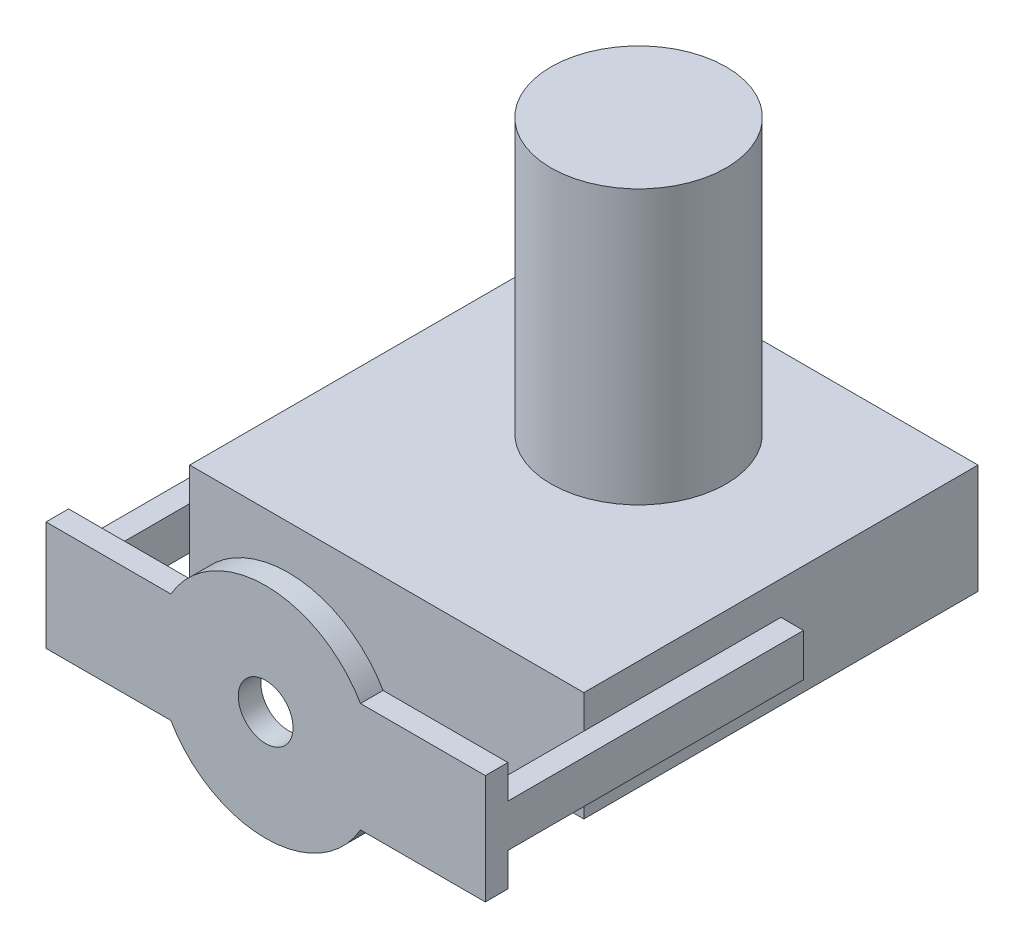
ISO-10303-21;
HEADER;
FILE_DESCRIPTION(('STEP AP214'),'2;1');
FILE_NAME('part.step','',(''),(''),'','','');
FILE_SCHEMA(('AUTOMOTIVE_DESIGN { 1 0 10303 214 1 1 1 1 }'));
ENDSEC;
DATA;
#1=APPLICATION_CONTEXT('core data for automotive mechanical design processes');
#2=APPLICATION_PROTOCOL_DEFINITION('international standard','automotive_design',2000,#1);
#3=PRODUCT_CONTEXT('',#1,'mechanical');
#4=PRODUCT('Part','Part','',(#3));
#5=PRODUCT_RELATED_PRODUCT_CATEGORY('part','',(#4));
#6=PRODUCT_DEFINITION_FORMATION('','',#4);
#7=PRODUCT_DEFINITION_CONTEXT('part definition',#1,'design');
#8=PRODUCT_DEFINITION('design','',#6,#7);
#9=PRODUCT_DEFINITION_SHAPE('','',#8);
#10=(LENGTH_UNIT() NAMED_UNIT(*) SI_UNIT(.MILLI.,.METRE.));
#11=(NAMED_UNIT(*) PLANE_ANGLE_UNIT() SI_UNIT($,.RADIAN.));
#12=(NAMED_UNIT(*) SI_UNIT($,.STERADIAN.) SOLID_ANGLE_UNIT());
#13=UNCERTAINTY_MEASURE_WITH_UNIT(LENGTH_MEASURE(1.E-05),#10,'distance_accuracy_value','');
#14=(GEOMETRIC_REPRESENTATION_CONTEXT(3) GLOBAL_UNCERTAINTY_ASSIGNED_CONTEXT((#13)) GLOBAL_UNIT_ASSIGNED_CONTEXT((#10,
#11,#12)) REPRESENTATION_CONTEXT('',''));
#15=CARTESIAN_POINT('',(0.,0.,0.));
#16=DIRECTION('',(0.,0.,1.));
#17=DIRECTION('',(1.,0.,0.));
#18=AXIS2_PLACEMENT_3D('',#15,#16,#17);
#19=CARTESIAN_POINT('',(18.,10.,-18.));
#20=DIRECTION('',(-1.,0.,0.));
#21=DIRECTION('',(0.,0.,1.));
#22=AXIS2_PLACEMENT_3D('',#19,#20,#21);
#23=PLANE('',#22);
#24=DIRECTION('',(0.,0.,-1.));
#25=VECTOR('',#24,1.);
#26=CARTESIAN_POINT('',(18.,3.05,27.));
#27=LINE('',#26,#25);
#28=CARTESIAN_POINT('',(18.,3.05,18.));
#29=VERTEX_POINT('',#28);
#30=CARTESIAN_POINT('',(18.,3.05,0.));
#31=VERTEX_POINT('',#30);
#32=EDGE_CURVE('E11',#29,#31,#27,.T.);
#33=ORIENTED_EDGE('',*,*,#32,.F.);
#34=DIRECTION('',(0.,-1.,0.));
#35=VECTOR('',#34,1.);
#36=CARTESIAN_POINT('',(18.,10.,18.));
#37=LINE('',#36,#35);
#38=CARTESIAN_POINT('',(18.,0.,18.));
#39=VERTEX_POINT('',#38);
#40=EDGE_CURVE('E285',#29,#39,#37,.T.);
#41=ORIENTED_EDGE('',*,*,#40,.T.);
#42=DIRECTION('',(0.,0.,-1.));
#43=VECTOR('',#42,1.);
#44=CARTESIAN_POINT('',(18.,0.,-18.));
#45=LINE('',#44,#43);
#46=CARTESIAN_POINT('',(18.,0.,-18.));
#47=VERTEX_POINT('',#46);
#48=EDGE_CURVE('E272',#39,#47,#45,.T.);
#49=ORIENTED_EDGE('',*,*,#48,.T.);
#50=DIRECTION('',(0.,-1.,0.));
#51=VECTOR('',#50,1.);
#52=CARTESIAN_POINT('',(18.,10.,-18.));
#53=LINE('',#52,#51);
#54=CARTESIAN_POINT('',(18.,10.,-18.));
#55=VERTEX_POINT('',#54);
#56=EDGE_CURVE('E36',#55,#47,#53,.T.);
#57=ORIENTED_EDGE('',*,*,#56,.F.);
#58=DIRECTION('',(0.,0.,-1.));
#59=VECTOR('',#58,1.);
#60=CARTESIAN_POINT('',(18.,10.,-18.));
#61=LINE('',#60,#59);
#62=CARTESIAN_POINT('',(18.,10.,18.));
#63=VERTEX_POINT('',#62);
#64=EDGE_CURVE('E275',#63,#55,#61,.T.);
#65=ORIENTED_EDGE('',*,*,#64,.F.);
#66=CARTESIAN_POINT('',(18.,6.95,18.));
#67=VERTEX_POINT('',#66);
#68=EDGE_CURVE('E295',#63,#67,#37,.T.);
#69=ORIENTED_EDGE('',*,*,#68,.T.);
#70=DIRECTION('',(0.,0.,1.));
#71=VECTOR('',#70,1.);
#72=CARTESIAN_POINT('',(18.,6.95,27.));
#73=LINE('',#72,#71);
#74=CARTESIAN_POINT('',(18.,6.95,0.));
#75=VERTEX_POINT('',#74);
#76=EDGE_CURVE('E54',#75,#67,#73,.T.);
#77=ORIENTED_EDGE('',*,*,#76,.F.);
#78=DIRECTION('',(0.,1.,0.));
#79=VECTOR('',#78,1.);
#80=CARTESIAN_POINT('',(18.,3.05,0.));
#81=LINE('',#80,#79);
#82=EDGE_CURVE('E50',#31,#75,#81,.T.);
#83=ORIENTED_EDGE('',*,*,#82,.F.);
#84=EDGE_LOOP('',(#33,#41,#49,#57,#65,#69,#77,#83));
#85=FACE_BOUND('',#84,.T.);
#86=ADVANCED_FACE('F33',(#85),#23,.F.);
#87=CARTESIAN_POINT('',(-18.,10.,-18.));
#88=DIRECTION('',(1.,0.,0.));
#89=DIRECTION('',(0.,0.,-1.));
#90=AXIS2_PLACEMENT_3D('',#87,#88,#89);
#91=PLANE('',#90);
#92=DIRECTION('',(0.,0.,1.));
#93=VECTOR('',#92,1.);
#94=CARTESIAN_POINT('',(-18.,3.05,0.));
#95=LINE('',#94,#93);
#96=CARTESIAN_POINT('',(-18.,3.05,0.));
#97=VERTEX_POINT('',#96);
#98=CARTESIAN_POINT('',(-18.,3.05,18.));
#99=VERTEX_POINT('',#98);
#100=EDGE_CURVE('E241',#97,#99,#95,.T.);
#101=ORIENTED_EDGE('',*,*,#100,.F.);
#102=DIRECTION('',(0.,-1.,0.));
#103=VECTOR('',#102,1.);
#104=CARTESIAN_POINT('',(-18.,3.05,0.));
#105=LINE('',#104,#103);
#106=CARTESIAN_POINT('',(-18.,6.95,0.));
#107=VERTEX_POINT('',#106);
#108=EDGE_CURVE('E251',#107,#97,#105,.T.);
#109=ORIENTED_EDGE('',*,*,#108,.F.);
#110=DIRECTION('',(0.,0.,-1.));
#111=VECTOR('',#110,1.);
#112=CARTESIAN_POINT('',(-18.,6.95,0.));
#113=LINE('',#112,#111);
#114=CARTESIAN_POINT('',(-18.,6.95,18.));
#115=VERTEX_POINT('',#114);
#116=EDGE_CURVE('E41',#115,#107,#113,.T.);
#117=ORIENTED_EDGE('',*,*,#116,.F.);
#118=DIRECTION('',(0.,-1.,0.));
#119=VECTOR('',#118,1.);
#120=CARTESIAN_POINT('',(-18.,10.,18.));
#121=LINE('',#120,#119);
#122=CARTESIAN_POINT('',(-18.,10.,18.));
#123=VERTEX_POINT('',#122);
#124=EDGE_CURVE('E299',#123,#115,#121,.T.);
#125=ORIENTED_EDGE('',*,*,#124,.F.);
#126=DIRECTION('',(0.,0.,1.));
#127=VECTOR('',#126,1.);
#128=CARTESIAN_POINT('',(-18.,10.,-18.));
#129=LINE('',#128,#127);
#130=CARTESIAN_POINT('',(-18.,10.,-18.));
#131=VERTEX_POINT('',#130);
#132=EDGE_CURVE('E281',#131,#123,#129,.T.);
#133=ORIENTED_EDGE('',*,*,#132,.F.);
#134=DIRECTION('',(0.,-1.,0.));
#135=VECTOR('',#134,1.);
#136=CARTESIAN_POINT('',(-18.,10.,-18.));
#137=LINE('',#136,#135);
#138=CARTESIAN_POINT('',(-18.,0.,-18.));
#139=VERTEX_POINT('',#138);
#140=EDGE_CURVE('E301',#131,#139,#137,.T.);
#141=ORIENTED_EDGE('',*,*,#140,.T.);
#142=DIRECTION('',(0.,0.,1.));
#143=VECTOR('',#142,1.);
#144=CARTESIAN_POINT('',(-18.,0.,-18.));
#145=LINE('',#144,#143);
#146=CARTESIAN_POINT('',(-18.,0.,18.));
#147=VERTEX_POINT('',#146);
#148=EDGE_CURVE('E290',#139,#147,#145,.T.);
#149=ORIENTED_EDGE('',*,*,#148,.T.);
#150=EDGE_CURVE('E297',#99,#147,#121,.T.);
#151=ORIENTED_EDGE('',*,*,#150,.F.);
#152=EDGE_LOOP('',(#101,#109,#117,#125,#133,#141,#149,#151));
#153=FACE_BOUND('',#152,.T.);
#154=ADVANCED_FACE('F339',(#153),#91,.F.);
#155=CARTESIAN_POINT('',(-18.,10.,-18.));
#156=DIRECTION('',(0.,0.,1.));
#157=DIRECTION('',(1.,0.,0.));
#158=AXIS2_PLACEMENT_3D('',#155,#156,#157);
#159=PLANE('',#158);
#160=DIRECTION('',(-1.,0.,0.));
#161=VECTOR('',#160,1.);
#162=CARTESIAN_POINT('',(-18.,0.,-18.));
#163=LINE('',#162,#161);
#164=EDGE_CURVE('E288',#47,#139,#163,.T.);
#165=ORIENTED_EDGE('',*,*,#164,.T.);
#166=ORIENTED_EDGE('',*,*,#140,.F.);
#167=DIRECTION('',(-1.,0.,0.));
#168=VECTOR('',#167,1.);
#169=CARTESIAN_POINT('',(-18.,10.,-18.));
#170=LINE('',#169,#168);
#171=EDGE_CURVE('E278',#55,#131,#170,.T.);
#172=ORIENTED_EDGE('',*,*,#171,.F.);
#173=ORIENTED_EDGE('',*,*,#56,.T.);
#174=EDGE_LOOP('',(#165,#166,#172,#173));
#175=FACE_BOUND('',#174,.T.);
#176=ADVANCED_FACE('F349',(#175),#159,.F.);
#177=CARTESIAN_POINT('',(-18.,10.,18.));
#178=DIRECTION('',(0.,0.,-1.));
#179=DIRECTION('',(-1.,0.,0.));
#180=AXIS2_PLACEMENT_3D('',#177,#178,#179);
#181=PLANE('',#180);
#182=DIRECTION('',(1.,0.,0.));
#183=VECTOR('',#182,1.);
#184=CARTESIAN_POINT('',(-18.,0.,18.));
#185=LINE('',#184,#183);
#186=EDGE_CURVE('E279',#147,#39,#185,.T.);
#187=ORIENTED_EDGE('',*,*,#186,.T.);
#188=ORIENTED_EDGE('',*,*,#40,.F.);
#189=EDGE_CURVE('E298',#67,#29,#37,.T.);
#190=ORIENTED_EDGE('',*,*,#189,.F.);
#191=ORIENTED_EDGE('',*,*,#68,.F.);
#192=DIRECTION('',(1.,0.,0.));
#193=VECTOR('',#192,1.);
#194=CARTESIAN_POINT('',(-18.,10.,18.));
#195=LINE('',#194,#193);
#196=EDGE_CURVE('E283',#123,#63,#195,.T.);
#197=ORIENTED_EDGE('',*,*,#196,.F.);
#198=ORIENTED_EDGE('',*,*,#124,.T.);
#199=EDGE_CURVE('E302',#115,#99,#121,.T.);
#200=ORIENTED_EDGE('',*,*,#199,.T.);
#201=ORIENTED_EDGE('',*,*,#150,.T.);
#202=EDGE_LOOP('',(#187,#188,#190,#191,#197,#198,#200,#201));
#203=FACE_BOUND('',#202,.T.);
#204=ADVANCED_FACE('F343',(#203),#181,.F.);
#205=CARTESIAN_POINT('',(0.,10.,0.));
#206=DIRECTION('',(0.,1.,0.));
#207=DIRECTION('',(0.,0.,1.));
#208=AXIS2_PLACEMENT_3D('',#205,#206,#207);
#209=PLANE('',#208);
#210=CARTESIAN_POINT('',(0.,10.,-5.));
#211=DIRECTION('',(0.,1.,0.));
#212=DIRECTION('',(0.,0.,1.));
#213=AXIS2_PLACEMENT_3D('',#210,#211,#212);
#214=CIRCLE('',#213,8.);
#215=CARTESIAN_POINT('',(0.,10.,3.));
#216=VERTEX_POINT('',#215);
#217=EDGE_CURVE('E268',#216,#216,#214,.T.);
#218=ORIENTED_EDGE('',*,*,#217,.F.);
#219=EDGE_LOOP('',(#218));
#220=FACE_BOUND('',#219,.T.);
#221=ORIENTED_EDGE('',*,*,#64,.T.);
#222=ORIENTED_EDGE('',*,*,#171,.T.);
#223=ORIENTED_EDGE('',*,*,#132,.T.);
#224=ORIENTED_EDGE('',*,*,#196,.T.);
#225=EDGE_LOOP('',(#221,#222,#223,#224));
#226=FACE_BOUND('',#225,.T.);
#227=ADVANCED_FACE('F347',(#220,#226),#209,.T.);
#228=CARTESIAN_POINT('',(0.,0.,0.));
#229=DIRECTION('',(0.,1.,0.));
#230=DIRECTION('',(0.,0.,1.));
#231=AXIS2_PLACEMENT_3D('',#228,#229,#230);
#232=PLANE('',#231);
#233=ORIENTED_EDGE('',*,*,#48,.F.);
#234=ORIENTED_EDGE('',*,*,#186,.F.);
#235=ORIENTED_EDGE('',*,*,#148,.F.);
#236=ORIENTED_EDGE('',*,*,#164,.F.);
#237=EDGE_LOOP('',(#233,#234,#235,#236));
#238=FACE_BOUND('',#237,.T.);
#239=ADVANCED_FACE('F352',(#238),#232,.F.);
#240=CARTESIAN_POINT('',(0.,35.,-5.));
#241=DIRECTION('',(0.,-1.,0.));
#242=DIRECTION('',(0.,0.,-1.));
#243=AXIS2_PLACEMENT_3D('',#240,#241,#242);
#244=CYLINDRICAL_SURFACE('',#243,8.);
#245=CARTESIAN_POINT('',(0.,35.,-5.));
#246=DIRECTION('',(0.,1.,0.));
#247=DIRECTION('',(0.,0.,1.));
#248=AXIS2_PLACEMENT_3D('',#245,#246,#247);
#249=CIRCLE('',#248,8.);
#250=CARTESIAN_POINT('',(0.,35.,3.));
#251=VERTEX_POINT('',#250);
#252=EDGE_CURVE('E269',#251,#251,#249,.T.);
#253=ORIENTED_EDGE('',*,*,#252,.F.);
#254=EDGE_LOOP('',(#253));
#255=FACE_BOUND('',#254,.T.);
#256=ORIENTED_EDGE('',*,*,#217,.T.);
#257=EDGE_LOOP('',(#256));
#258=FACE_BOUND('',#257,.T.);
#259=ADVANCED_FACE('F451',(#255,#258),#244,.T.);
#260=CARTESIAN_POINT('',(0.,35.,-5.));
#261=DIRECTION('',(0.,1.,0.));
#262=DIRECTION('',(0.,0.,1.));
#263=AXIS2_PLACEMENT_3D('',#260,#261,#262);
#264=PLANE('',#263);
#265=ORIENTED_EDGE('',*,*,#252,.T.);
#266=EDGE_LOOP('',(#265));
#267=FACE_BOUND('',#266,.T.);
#268=ADVANCED_FACE('F457',(#267),#264,.T.);
#269=CARTESIAN_POINT('',(-18.,0.,0.));
#270=DIRECTION('',(1.,0.,0.));
#271=DIRECTION('',(0.,0.,-1.));
#272=AXIS2_PLACEMENT_3D('',#269,#270,#271);
#273=PLANE('',#272);
#274=ORIENTED_EDGE('',*,*,#199,.F.);
#275=CARTESIAN_POINT('',(-18.,6.95,27.));
#276=VERTEX_POINT('',#275);
#277=EDGE_CURVE('E248',#276,#115,#113,.T.);
#278=ORIENTED_EDGE('',*,*,#277,.F.);
#279=DIRECTION('',(0.,1.,0.));
#280=VECTOR('',#279,1.);
#281=CARTESIAN_POINT('',(-18.,3.05,27.));
#282=LINE('',#281,#280);
#283=CARTESIAN_POINT('',(-18.,3.05,27.));
#284=VERTEX_POINT('',#283);
#285=EDGE_CURVE('E237',#284,#276,#282,.T.);
#286=ORIENTED_EDGE('',*,*,#285,.F.);
#287=EDGE_CURVE('E254',#99,#284,#95,.T.);
#288=ORIENTED_EDGE('',*,*,#287,.F.);
#289=EDGE_LOOP('',(#274,#278,#286,#288));
#290=FACE_BOUND('',#289,.T.);
#291=ADVANCED_FACE('F336',(#290),#273,.T.);
#292=CARTESIAN_POINT('',(-20.0630946608402,6.95,0.));
#293=DIRECTION('',(0.,-1.,0.));
#294=DIRECTION('',(0.,0.,-1.));
#295=AXIS2_PLACEMENT_3D('',#292,#293,#294);
#296=PLANE('',#295);
#297=ORIENTED_EDGE('',*,*,#277,.T.);
#298=ORIENTED_EDGE('',*,*,#116,.T.);
#299=DIRECTION('',(1.,0.,0.));
#300=VECTOR('',#299,1.);
#301=CARTESIAN_POINT('',(-20.0630946608402,6.95,0.));
#302=LINE('',#301,#300);
#303=CARTESIAN_POINT('',(-20.0630946608402,6.95,0.));
#304=VERTEX_POINT('',#303);
#305=EDGE_CURVE('E262',#304,#107,#302,.T.);
#306=ORIENTED_EDGE('',*,*,#305,.F.);
#307=DIRECTION('',(0.,0.,-1.));
#308=VECTOR('',#307,1.);
#309=CARTESIAN_POINT('',(-20.0630946608402,6.95,0.));
#310=LINE('',#309,#308);
#311=CARTESIAN_POINT('',(-20.0630946608402,6.95,27.));
#312=VERTEX_POINT('',#311);
#313=EDGE_CURVE('E238',#312,#304,#310,.T.);
#314=ORIENTED_EDGE('',*,*,#313,.F.);
#315=DIRECTION('',(1.,0.,0.));
#316=VECTOR('',#315,1.);
#317=CARTESIAN_POINT('',(-20.0630946608402,6.95,27.));
#318=LINE('',#317,#316);
#319=EDGE_CURVE('E265',#312,#276,#318,.T.);
#320=ORIENTED_EDGE('',*,*,#319,.T.);
#321=EDGE_LOOP('',(#297,#298,#306,#314,#320));
#322=FACE_BOUND('',#321,.T.);
#323=ADVANCED_FACE('F314',(#322),#296,.F.);
#324=CARTESIAN_POINT('',(-20.0630946608402,3.05,0.));
#325=DIRECTION('',(0.,0.,1.));
#326=DIRECTION('',(0.,-1.,0.));
#327=AXIS2_PLACEMENT_3D('',#324,#325,#326);
#328=PLANE('',#327);
#329=ORIENTED_EDGE('',*,*,#108,.T.);
#330=DIRECTION('',(1.,0.,0.));
#331=VECTOR('',#330,1.);
#332=CARTESIAN_POINT('',(-20.0630946608402,3.05,0.));
#333=LINE('',#332,#331);
#334=CARTESIAN_POINT('',(-20.0630946608402,3.05,0.));
#335=VERTEX_POINT('',#334);
#336=EDGE_CURVE('E259',#335,#97,#333,.T.);
#337=ORIENTED_EDGE('',*,*,#336,.F.);
#338=DIRECTION('',(0.,-1.,0.));
#339=VECTOR('',#338,1.);
#340=CARTESIAN_POINT('',(-20.0630946608402,3.05,0.));
#341=LINE('',#340,#339);
#342=EDGE_CURVE('E240',#304,#335,#341,.T.);
#343=ORIENTED_EDGE('',*,*,#342,.F.);
#344=ORIENTED_EDGE('',*,*,#305,.T.);
#345=EDGE_LOOP('',(#329,#337,#343,#344));
#346=FACE_BOUND('',#345,.T.);
#347=ADVANCED_FACE('F318',(#346),#328,.F.);
#348=CARTESIAN_POINT('',(-20.0630946608402,3.05,0.));
#349=DIRECTION('',(0.,1.,0.));
#350=DIRECTION('',(0.,0.,1.));
#351=AXIS2_PLACEMENT_3D('',#348,#349,#350);
#352=PLANE('',#351);
#353=ORIENTED_EDGE('',*,*,#100,.T.);
#354=ORIENTED_EDGE('',*,*,#287,.T.);
#355=DIRECTION('',(1.,0.,0.));
#356=VECTOR('',#355,1.);
#357=CARTESIAN_POINT('',(-20.0630946608402,3.05,27.));
#358=LINE('',#357,#356);
#359=CARTESIAN_POINT('',(-20.0630946608402,3.05,27.));
#360=VERTEX_POINT('',#359);
#361=EDGE_CURVE('E245',#360,#284,#358,.T.);
#362=ORIENTED_EDGE('',*,*,#361,.F.);
#363=DIRECTION('',(0.,0.,1.));
#364=VECTOR('',#363,1.);
#365=CARTESIAN_POINT('',(-20.0630946608402,3.05,0.));
#366=LINE('',#365,#364);
#367=EDGE_CURVE('E243',#335,#360,#366,.T.);
#368=ORIENTED_EDGE('',*,*,#367,.F.);
#369=ORIENTED_EDGE('',*,*,#336,.T.);
#370=EDGE_LOOP('',(#353,#354,#362,#368,#369));
#371=FACE_BOUND('',#370,.T.);
#372=ADVANCED_FACE('F338',(#371),#352,.F.);
#373=CARTESIAN_POINT('',(-20.0630946608402,0.,0.));
#374=DIRECTION('',(1.,0.,0.));
#375=DIRECTION('',(0.,0.,-1.));
#376=AXIS2_PLACEMENT_3D('',#373,#374,#375);
#377=PLANE('',#376);
#378=ORIENTED_EDGE('',*,*,#367,.T.);
#379=DIRECTION('',(0.,-1.,0.));
#380=VECTOR('',#379,1.);
#381=CARTESIAN_POINT('',(-20.0630946608402,0.,27.));
#382=LINE('',#381,#380);
#383=CARTESIAN_POINT('',(-20.0630946608402,0.,27.));
#384=VERTEX_POINT('',#383);
#385=EDGE_CURVE('E403',#360,#384,#382,.T.);
#386=ORIENTED_EDGE('',*,*,#385,.T.);
#387=DIRECTION('',(0.,0.,-1.));
#388=VECTOR('',#387,1.);
#389=CARTESIAN_POINT('',(-20.0630946608402,0.,29.0630946608402));
#390=LINE('',#389,#388);
#391=CARTESIAN_POINT('',(-20.0630946608402,0.,29.0630946608402));
#392=VERTEX_POINT('',#391);
#393=EDGE_CURVE('E211',#392,#384,#390,.T.);
#394=ORIENTED_EDGE('',*,*,#393,.F.);
#395=DIRECTION('',(0.,-1.,0.));
#396=VECTOR('',#395,1.);
#397=CARTESIAN_POINT('',(-20.0630946608402,0.,29.0630946608402));
#398=LINE('',#397,#396);
#399=CARTESIAN_POINT('',(-20.0630946608402,9.99999999999998,29.0630946608402));
#400=VERTEX_POINT('',#399);
#401=EDGE_CURVE('E192',#400,#392,#398,.T.);
#402=ORIENTED_EDGE('',*,*,#401,.F.);
#403=DIRECTION('',(0.,0.,-1.));
#404=VECTOR('',#403,1.);
#405=CARTESIAN_POINT('',(-20.0630946608402,9.99999999999998,29.0630946608402));
#406=LINE('',#405,#404);
#407=CARTESIAN_POINT('',(-20.0630946608402,9.99999999999998,27.));
#408=VERTEX_POINT('',#407);
#409=EDGE_CURVE('E189',#400,#408,#406,.T.);
#410=ORIENTED_EDGE('',*,*,#409,.T.);
#411=EDGE_CURVE('E326',#408,#312,#382,.T.);
#412=ORIENTED_EDGE('',*,*,#411,.T.);
#413=ORIENTED_EDGE('',*,*,#313,.T.);
#414=ORIENTED_EDGE('',*,*,#342,.T.);
#415=EDGE_LOOP('',(#378,#386,#394,#402,#410,#412,#413,#414));
#416=FACE_BOUND('',#415,.T.);
#417=ADVANCED_FACE('F322',(#416),#377,.F.);
#418=CARTESIAN_POINT('',(20.0630946608402,3.05,0.));
#419=DIRECTION('',(0.,0.,1.));
#420=DIRECTION('',(0.,-1.,0.));
#421=AXIS2_PLACEMENT_3D('',#418,#419,#420);
#422=PLANE('',#421);
#423=ORIENTED_EDGE('',*,*,#82,.T.);
#424=DIRECTION('',(-1.,0.,0.));
#425=VECTOR('',#424,1.);
#426=CARTESIAN_POINT('',(20.0630946608402,6.95,0.));
#427=LINE('',#426,#425);
#428=CARTESIAN_POINT('',(20.0630946608402,6.95,0.));
#429=VERTEX_POINT('',#428);
#430=EDGE_CURVE('E235',#429,#75,#427,.T.);
#431=ORIENTED_EDGE('',*,*,#430,.F.);
#432=DIRECTION('',(0.,1.,0.));
#433=VECTOR('',#432,1.);
#434=CARTESIAN_POINT('',(20.0630946608402,3.05,0.));
#435=LINE('',#434,#433);
#436=CARTESIAN_POINT('',(20.0630946608402,3.05,0.));
#437=VERTEX_POINT('',#436);
#438=EDGE_CURVE('E215',#437,#429,#435,.T.);
#439=ORIENTED_EDGE('',*,*,#438,.F.);
#440=DIRECTION('',(-1.,0.,0.));
#441=VECTOR('',#440,1.);
#442=CARTESIAN_POINT('',(20.0630946608402,3.05,0.));
#443=LINE('',#442,#441);
#444=EDGE_CURVE('E221',#437,#31,#443,.T.);
#445=ORIENTED_EDGE('',*,*,#444,.T.);
#446=EDGE_LOOP('',(#423,#431,#439,#445));
#447=FACE_BOUND('',#446,.T.);
#448=ADVANCED_FACE('F472',(#447),#422,.F.);
#449=CARTESIAN_POINT('',(20.0630946608402,6.95,27.));
#450=DIRECTION('',(0.,-1.,0.));
#451=DIRECTION('',(0.,0.,-1.));
#452=AXIS2_PLACEMENT_3D('',#449,#450,#451);
#453=PLANE('',#452);
#454=ORIENTED_EDGE('',*,*,#76,.T.);
#455=CARTESIAN_POINT('',(18.,6.95,27.));
#456=VERTEX_POINT('',#455);
#457=EDGE_CURVE('E209',#67,#456,#73,.T.);
#458=ORIENTED_EDGE('',*,*,#457,.T.);
#459=DIRECTION('',(-1.,0.,0.));
#460=VECTOR('',#459,1.);
#461=CARTESIAN_POINT('',(20.0630946608402,6.95,27.));
#462=LINE('',#461,#460);
#463=CARTESIAN_POINT('',(20.0630946608402,6.95,27.));
#464=VERTEX_POINT('',#463);
#465=EDGE_CURVE('E232',#464,#456,#462,.T.);
#466=ORIENTED_EDGE('',*,*,#465,.F.);
#467=DIRECTION('',(0.,0.,1.));
#468=VECTOR('',#467,1.);
#469=CARTESIAN_POINT('',(20.0630946608402,6.95,27.));
#470=LINE('',#469,#468);
#471=EDGE_CURVE('E218',#429,#464,#470,.T.);
#472=ORIENTED_EDGE('',*,*,#471,.F.);
#473=ORIENTED_EDGE('',*,*,#430,.T.);
#474=EDGE_LOOP('',(#454,#458,#466,#472,#473));
#475=FACE_BOUND('',#474,.T.);
#476=ADVANCED_FACE('F475',(#475),#453,.F.);
#477=CARTESIAN_POINT('',(20.0630946608402,3.05,27.));
#478=DIRECTION('',(0.,1.,0.));
#479=DIRECTION('',(0.,0.,1.));
#480=AXIS2_PLACEMENT_3D('',#477,#478,#479);
#481=PLANE('',#480);
#482=CARTESIAN_POINT('',(18.,3.05,27.));
#483=VERTEX_POINT('',#482);
#484=EDGE_CURVE('E43',#483,#29,#27,.T.);
#485=ORIENTED_EDGE('',*,*,#484,.T.);
#486=ORIENTED_EDGE('',*,*,#32,.T.);
#487=ORIENTED_EDGE('',*,*,#444,.F.);
#488=DIRECTION('',(0.,0.,-1.));
#489=VECTOR('',#488,1.);
#490=CARTESIAN_POINT('',(20.0630946608402,3.05,27.));
#491=LINE('',#490,#489);
#492=CARTESIAN_POINT('',(20.0630946608402,3.05,27.));
#493=VERTEX_POINT('',#492);
#494=EDGE_CURVE('E220',#493,#437,#491,.T.);
#495=ORIENTED_EDGE('',*,*,#494,.F.);
#496=DIRECTION('',(-1.,0.,0.));
#497=VECTOR('',#496,1.);
#498=CARTESIAN_POINT('',(20.0630946608402,3.05,27.));
#499=LINE('',#498,#497);
#500=EDGE_CURVE('E230',#493,#483,#499,.T.);
#501=ORIENTED_EDGE('',*,*,#500,.T.);
#502=EDGE_LOOP('',(#485,#486,#487,#495,#501));
#503=FACE_BOUND('',#502,.T.);
#504=ADVANCED_FACE('F362',(#503),#481,.F.);
#505=CARTESIAN_POINT('',(20.0630946608402,0.,0.));
#506=DIRECTION('',(-1.,0.,0.));
#507=DIRECTION('',(0.,0.,1.));
#508=AXIS2_PLACEMENT_3D('',#505,#506,#507);
#509=PLANE('',#508);
#510=ORIENTED_EDGE('',*,*,#438,.T.);
#511=ORIENTED_EDGE('',*,*,#471,.T.);
#512=DIRECTION('',(0.,1.,0.));
#513=VECTOR('',#512,1.);
#514=CARTESIAN_POINT('',(20.0630946608402,9.99999999999998,27.));
#515=LINE('',#514,#513);
#516=CARTESIAN_POINT('',(20.0630946608402,9.99999999999998,27.));
#517=VERTEX_POINT('',#516);
#518=EDGE_CURVE('E375',#464,#517,#515,.T.);
#519=ORIENTED_EDGE('',*,*,#518,.T.);
#520=DIRECTION('',(0.,0.,-1.));
#521=VECTOR('',#520,1.);
#522=CARTESIAN_POINT('',(20.0630946608402,9.99999999999998,29.0630946608402));
#523=LINE('',#522,#521);
#524=CARTESIAN_POINT('',(20.0630946608402,9.99999999999998,29.0630946608402));
#525=VERTEX_POINT('',#524);
#526=EDGE_CURVE('E384',#525,#517,#523,.T.);
#527=ORIENTED_EDGE('',*,*,#526,.F.);
#528=DIRECTION('',(0.,1.,0.));
#529=VECTOR('',#528,1.);
#530=CARTESIAN_POINT('',(20.0630946608402,3.05,29.0630946608402));
#531=LINE('',#530,#529);
#532=CARTESIAN_POINT('',(20.0630946608402,0.,29.0630946608402));
#533=VERTEX_POINT('',#532);
#534=EDGE_CURVE('E413',#533,#525,#531,.T.);
#535=ORIENTED_EDGE('',*,*,#534,.F.);
#536=DIRECTION('',(0.,0.,-1.));
#537=VECTOR('',#536,1.);
#538=CARTESIAN_POINT('',(20.0630946608402,0.,29.0630946608402));
#539=LINE('',#538,#537);
#540=CARTESIAN_POINT('',(20.0630946608402,0.,27.));
#541=VERTEX_POINT('',#540);
#542=EDGE_CURVE('E374',#533,#541,#539,.T.);
#543=ORIENTED_EDGE('',*,*,#542,.T.);
#544=EDGE_CURVE('E367',#541,#493,#515,.T.);
#545=ORIENTED_EDGE('',*,*,#544,.T.);
#546=ORIENTED_EDGE('',*,*,#494,.T.);
#547=EDGE_LOOP('',(#510,#511,#519,#527,#535,#543,#545,#546));
#548=FACE_BOUND('',#547,.T.);
#549=ADVANCED_FACE('F371',(#548),#509,.F.);
#550=CARTESIAN_POINT('',(18.,0.,0.));
#551=DIRECTION('',(-1.,0.,0.));
#552=DIRECTION('',(0.,0.,1.));
#553=AXIS2_PLACEMENT_3D('',#550,#551,#552);
#554=PLANE('',#553);
#555=ORIENTED_EDGE('',*,*,#457,.F.);
#556=ORIENTED_EDGE('',*,*,#189,.T.);
#557=ORIENTED_EDGE('',*,*,#484,.F.);
#558=DIRECTION('',(0.,-1.,0.));
#559=VECTOR('',#558,1.);
#560=CARTESIAN_POINT('',(18.,3.05,27.));
#561=LINE('',#560,#559);
#562=EDGE_CURVE('E224',#456,#483,#561,.T.);
#563=ORIENTED_EDGE('',*,*,#562,.F.);
#564=EDGE_LOOP('',(#555,#556,#557,#563));
#565=FACE_BOUND('',#564,.T.);
#566=ADVANCED_FACE('F359',(#565),#554,.T.);
#567=CARTESIAN_POINT('',(0.,5.,29.0630946608402));
#568=DIRECTION('',(0.,0.,1.));
#569=DIRECTION('',(1.,0.,0.));
#570=AXIS2_PLACEMENT_3D('',#567,#568,#569);
#571=PLANE('',#570);
#572=CARTESIAN_POINT('',(0.,5.,29.0630946608402));
#573=DIRECTION('',(0.,0.,1.));
#574=DIRECTION('',(1.,0.,0.));
#575=AXIS2_PLACEMENT_3D('',#572,#573,#574);
#576=CIRCLE('',#575,10.);
#577=CARTESIAN_POINT('',(8.6602540378444,9.99999999999998,29.0630946608402));
#578=VERTEX_POINT('',#577);
#579=CARTESIAN_POINT('',(-8.66025403784439,9.99999999999998,29.0630946608402));
#580=VERTEX_POINT('',#579);
#581=EDGE_CURVE('E193',#578,#580,#576,.T.);
#582=ORIENTED_EDGE('',*,*,#581,.T.);
#583=DIRECTION('',(-1.,0.,0.));
#584=VECTOR('',#583,1.);
#585=CARTESIAN_POINT('',(-20.0630946608402,9.99999999999998,29.0630946608402));
#586=LINE('',#585,#584);
#587=EDGE_CURVE('E182',#580,#400,#586,.T.);
#588=ORIENTED_EDGE('',*,*,#587,.T.);
#589=ORIENTED_EDGE('',*,*,#401,.T.);
#590=DIRECTION('',(1.,0.,0.));
#591=VECTOR('',#590,1.);
#592=CARTESIAN_POINT('',(-8.66025403784439,0.,29.0630946608402));
#593=LINE('',#592,#591);
#594=CARTESIAN_POINT('',(-8.66025403784439,0.,29.0630946608402));
#595=VERTEX_POINT('',#594);
#596=EDGE_CURVE('E401',#392,#595,#593,.T.);
#597=ORIENTED_EDGE('',*,*,#596,.T.);
#598=CARTESIAN_POINT('',(0.,5.,29.0630946608402));
#599=DIRECTION('',(0.,0.,1.));
#600=DIRECTION('',(1.,0.,0.));
#601=AXIS2_PLACEMENT_3D('',#598,#599,#600);
#602=CIRCLE('',#601,10.);
#603=CARTESIAN_POINT('',(8.66025403784439,0.,29.0630946608402));
#604=VERTEX_POINT('',#603);
#605=EDGE_CURVE('E417',#595,#604,#602,.T.);
#606=ORIENTED_EDGE('',*,*,#605,.T.);
#607=DIRECTION('',(1.,0.,0.));
#608=VECTOR('',#607,1.);
#609=CARTESIAN_POINT('',(20.0630946608402,0.,29.0630946608402));
#610=LINE('',#609,#608);
#611=EDGE_CURVE('E415',#604,#533,#610,.T.);
#612=ORIENTED_EDGE('',*,*,#611,.T.);
#613=ORIENTED_EDGE('',*,*,#534,.T.);
#614=DIRECTION('',(-1.,0.,0.));
#615=VECTOR('',#614,1.);
#616=CARTESIAN_POINT('',(8.6602540378444,9.99999999999998,29.0630946608402));
#617=LINE('',#616,#615);
#618=EDGE_CURVE('E199',#525,#578,#617,.T.);
#619=ORIENTED_EDGE('',*,*,#618,.T.);
#620=EDGE_LOOP('',(#582,#588,#589,#597,#606,#612,#613,#619));
#621=FACE_BOUND('',#620,.T.);
#622=CARTESIAN_POINT('',(0.,5.,29.0630946608402));
#623=DIRECTION('',(0.,0.,1.));
#624=DIRECTION('',(1.,0.,0.));
#625=AXIS2_PLACEMENT_3D('',#622,#623,#624);
#626=CIRCLE('',#625,2.5);
#627=CARTESIAN_POINT('',(2.5,5.,29.0630946608402));
#628=VERTEX_POINT('',#627);
#629=EDGE_CURVE('E411',#628,#628,#626,.T.);
#630=ORIENTED_EDGE('',*,*,#629,.F.);
#631=EDGE_LOOP('',(#630));
#632=FACE_BOUND('',#631,.T.);
#633=ADVANCED_FACE('F196',(#621,#632),#571,.T.);
#634=CARTESIAN_POINT('',(0.,5.,27.));
#635=DIRECTION('',(0.,0.,1.));
#636=DIRECTION('',(1.,0.,0.));
#637=AXIS2_PLACEMENT_3D('',#634,#635,#636);
#638=PLANE('',#637);
#639=ORIENTED_EDGE('',*,*,#319,.F.);
#640=ORIENTED_EDGE('',*,*,#411,.F.);
#641=DIRECTION('',(-1.,0.,0.));
#642=VECTOR('',#641,1.);
#643=CARTESIAN_POINT('',(-20.0630946608402,9.99999999999998,27.));
#644=LINE('',#643,#642);
#645=CARTESIAN_POINT('',(-8.66025403784439,9.99999999999998,27.));
#646=VERTEX_POINT('',#645);
#647=EDGE_CURVE('E408',#646,#408,#644,.T.);
#648=ORIENTED_EDGE('',*,*,#647,.F.);
#649=CARTESIAN_POINT('',(0.,5.,27.));
#650=DIRECTION('',(0.,0.,1.));
#651=DIRECTION('',(1.,0.,0.));
#652=AXIS2_PLACEMENT_3D('',#649,#650,#651);
#653=CIRCLE('',#652,10.);
#654=CARTESIAN_POINT('',(8.6602540378444,9.99999999999998,27.));
#655=VERTEX_POINT('',#654);
#656=EDGE_CURVE('E207',#655,#646,#653,.T.);
#657=ORIENTED_EDGE('',*,*,#656,.F.);
#658=DIRECTION('',(-1.,0.,0.));
#659=VECTOR('',#658,1.);
#660=CARTESIAN_POINT('',(8.6602540378444,9.99999999999998,27.));
#661=LINE('',#660,#659);
#662=EDGE_CURVE('E203',#517,#655,#661,.T.);
#663=ORIENTED_EDGE('',*,*,#662,.F.);
#664=ORIENTED_EDGE('',*,*,#518,.F.);
#665=ORIENTED_EDGE('',*,*,#465,.T.);
#666=ORIENTED_EDGE('',*,*,#562,.T.);
#667=ORIENTED_EDGE('',*,*,#500,.F.);
#668=ORIENTED_EDGE('',*,*,#544,.F.);
#669=DIRECTION('',(1.,0.,0.));
#670=VECTOR('',#669,1.);
#671=CARTESIAN_POINT('',(20.0630946608402,0.,27.));
#672=LINE('',#671,#670);
#673=CARTESIAN_POINT('',(8.66025403784439,0.,27.));
#674=VERTEX_POINT('',#673);
#675=EDGE_CURVE('E378',#674,#541,#672,.T.);
#676=ORIENTED_EDGE('',*,*,#675,.F.);
#677=CARTESIAN_POINT('',(0.,5.,27.));
#678=DIRECTION('',(0.,0.,1.));
#679=DIRECTION('',(1.,0.,0.));
#680=AXIS2_PLACEMENT_3D('',#677,#678,#679);
#681=CIRCLE('',#680,10.);
#682=CARTESIAN_POINT('',(-8.66025403784439,0.,27.));
#683=VERTEX_POINT('',#682);
#684=EDGE_CURVE('E404',#683,#674,#681,.T.);
#685=ORIENTED_EDGE('',*,*,#684,.F.);
#686=DIRECTION('',(1.,0.,0.));
#687=VECTOR('',#686,1.);
#688=CARTESIAN_POINT('',(-8.66025403784439,0.,27.));
#689=LINE('',#688,#687);
#690=EDGE_CURVE('E400',#384,#683,#689,.T.);
#691=ORIENTED_EDGE('',*,*,#690,.F.);
#692=ORIENTED_EDGE('',*,*,#385,.F.);
#693=ORIENTED_EDGE('',*,*,#361,.T.);
#694=ORIENTED_EDGE('',*,*,#285,.T.);
#695=EDGE_LOOP('',(#639,#640,#648,#657,#663,#664,#665,#666,#667,#668,#676,#685,#691,#692,#693,#694));
#696=FACE_BOUND('',#695,.T.);
#697=CARTESIAN_POINT('',(0.,5.,27.));
#698=DIRECTION('',(0.,0.,1.));
#699=DIRECTION('',(1.,0.,0.));
#700=AXIS2_PLACEMENT_3D('',#697,#698,#699);
#701=CIRCLE('',#700,2.5);
#702=CARTESIAN_POINT('',(2.5,5.,27.));
#703=VERTEX_POINT('',#702);
#704=EDGE_CURVE('E421',#703,#703,#701,.T.);
#705=ORIENTED_EDGE('',*,*,#704,.T.);
#706=EDGE_LOOP('',(#705));
#707=FACE_BOUND('',#706,.T.);
#708=ADVANCED_FACE('F329',(#696,#707),#638,.F.);
#709=CARTESIAN_POINT('',(0.,5.,29.0630946608402));
#710=DIRECTION('',(0.,0.,-1.));
#711=DIRECTION('',(-1.,0.,0.));
#712=AXIS2_PLACEMENT_3D('',#709,#710,#711);
#713=CYLINDRICAL_SURFACE('',#712,10.);
#714=ORIENTED_EDGE('',*,*,#656,.T.);
#715=DIRECTION('',(0.,0.,-1.));
#716=VECTOR('',#715,1.);
#717=CARTESIAN_POINT('',(-8.66025403784439,9.99999999999998,29.0630946608402));
#718=LINE('',#717,#716);
#719=EDGE_CURVE('E186',#580,#646,#718,.T.);
#720=ORIENTED_EDGE('',*,*,#719,.F.);
#721=ORIENTED_EDGE('',*,*,#581,.F.);
#722=DIRECTION('',(0.,0.,-1.));
#723=VECTOR('',#722,1.);
#724=CARTESIAN_POINT('',(8.6602540378444,9.99999999999998,29.0630946608402));
#725=LINE('',#724,#723);
#726=EDGE_CURVE('E382',#578,#655,#725,.T.);
#727=ORIENTED_EDGE('',*,*,#726,.T.);
#728=EDGE_LOOP('',(#714,#720,#721,#727));
#729=FACE_BOUND('',#728,.T.);
#730=ADVANCED_FACE('F205',(#729),#713,.T.);
#731=CARTESIAN_POINT('',(-20.0630946608402,9.99999999999998,29.0630946608402));
#732=DIRECTION('',(0.,-1.,0.));
#733=DIRECTION('',(0.,0.,-1.));
#734=AXIS2_PLACEMENT_3D('',#731,#732,#733);
#735=PLANE('',#734);
#736=ORIENTED_EDGE('',*,*,#647,.T.);
#737=ORIENTED_EDGE('',*,*,#409,.F.);
#738=ORIENTED_EDGE('',*,*,#587,.F.);
#739=ORIENTED_EDGE('',*,*,#719,.T.);
#740=EDGE_LOOP('',(#736,#737,#738,#739));
#741=FACE_BOUND('',#740,.T.);
#742=ADVANCED_FACE('F184',(#741),#735,.F.);
#743=CARTESIAN_POINT('',(-8.66025403784439,0.,29.0630946608402));
#744=DIRECTION('',(0.,1.,0.));
#745=DIRECTION('',(-1.,0.,0.));
#746=AXIS2_PLACEMENT_3D('',#743,#744,#745);
#747=PLANE('',#746);
#748=ORIENTED_EDGE('',*,*,#690,.T.);
#749=DIRECTION('',(0.,0.,-1.));
#750=VECTOR('',#749,1.);
#751=CARTESIAN_POINT('',(-8.66025403784439,0.,29.0630946608402));
#752=LINE('',#751,#750);
#753=EDGE_CURVE('E391',#595,#683,#752,.T.);
#754=ORIENTED_EDGE('',*,*,#753,.F.);
#755=ORIENTED_EDGE('',*,*,#596,.F.);
#756=ORIENTED_EDGE('',*,*,#393,.T.);
#757=EDGE_LOOP('',(#748,#754,#755,#756));
#758=FACE_BOUND('',#757,.T.);
#759=ADVANCED_FACE('F398',(#758),#747,.F.);
#760=CARTESIAN_POINT('',(0.,5.,29.0630946608402));
#761=DIRECTION('',(0.,0.,-1.));
#762=DIRECTION('',(-1.,0.,0.));
#763=AXIS2_PLACEMENT_3D('',#760,#761,#762);
#764=CYLINDRICAL_SURFACE('',#763,10.);
#765=ORIENTED_EDGE('',*,*,#684,.T.);
#766=DIRECTION('',(0.,0.,-1.));
#767=VECTOR('',#766,1.);
#768=CARTESIAN_POINT('',(8.66025403784439,0.,29.0630946608402));
#769=LINE('',#768,#767);
#770=EDGE_CURVE('E388',#604,#674,#769,.T.);
#771=ORIENTED_EDGE('',*,*,#770,.F.);
#772=ORIENTED_EDGE('',*,*,#605,.F.);
#773=ORIENTED_EDGE('',*,*,#753,.T.);
#774=EDGE_LOOP('',(#765,#771,#772,#773));
#775=FACE_BOUND('',#774,.T.);
#776=ADVANCED_FACE('F490',(#775),#764,.T.);
#777=CARTESIAN_POINT('',(20.0630946608402,0.,29.0630946608402));
#778=DIRECTION('',(0.,1.,0.));
#779=DIRECTION('',(-1.,0.,0.));
#780=AXIS2_PLACEMENT_3D('',#777,#778,#779);
#781=PLANE('',#780);
#782=ORIENTED_EDGE('',*,*,#675,.T.);
#783=ORIENTED_EDGE('',*,*,#542,.F.);
#784=ORIENTED_EDGE('',*,*,#611,.F.);
#785=ORIENTED_EDGE('',*,*,#770,.T.);
#786=EDGE_LOOP('',(#782,#783,#784,#785));
#787=FACE_BOUND('',#786,.T.);
#788=ADVANCED_FACE('F493',(#787),#781,.F.);
#789=CARTESIAN_POINT('',(8.6602540378444,9.99999999999998,29.0630946608402));
#790=DIRECTION('',(0.,-1.,0.));
#791=DIRECTION('',(0.,0.,-1.));
#792=AXIS2_PLACEMENT_3D('',#789,#790,#791);
#793=PLANE('',#792);
#794=ORIENTED_EDGE('',*,*,#662,.T.);
#795=ORIENTED_EDGE('',*,*,#726,.F.);
#796=ORIENTED_EDGE('',*,*,#618,.F.);
#797=ORIENTED_EDGE('',*,*,#526,.T.);
#798=EDGE_LOOP('',(#794,#795,#796,#797));
#799=FACE_BOUND('',#798,.T.);
#800=ADVANCED_FACE('F497',(#799),#793,.F.);
#801=CARTESIAN_POINT('',(0.,5.,29.0630946608402));
#802=DIRECTION('',(0.,0.,-1.));
#803=DIRECTION('',(-1.,0.,0.));
#804=AXIS2_PLACEMENT_3D('',#801,#802,#803);
#805=CYLINDRICAL_SURFACE('',#804,2.5);
#806=ORIENTED_EDGE('',*,*,#629,.T.);
#807=EDGE_LOOP('',(#806));
#808=FACE_BOUND('',#807,.T.);
#809=ORIENTED_EDGE('',*,*,#704,.F.);
#810=EDGE_LOOP('',(#809));
#811=FACE_BOUND('',#810,.T.);
#812=ADVANCED_FACE('F427',(#808,#811),#805,.F.);
#813=CLOSED_SHELL('',(#86,#154,#176,#204,#227,#239,#259,#268,#291,#323,#347,#372,#417,#448,#476,
#504,#549,#566,#633,#708,#730,#742,#759,#776,#788,#800,#812));
#814=MANIFOLD_SOLID_BREP('B2',#813);
#815=ADVANCED_BREP_SHAPE_REPRESENTATION('',(#18,#814),#14);
#816=SHAPE_DEFINITION_REPRESENTATION(#9,#815);
ENDSEC;
END-ISO-10303-21;
